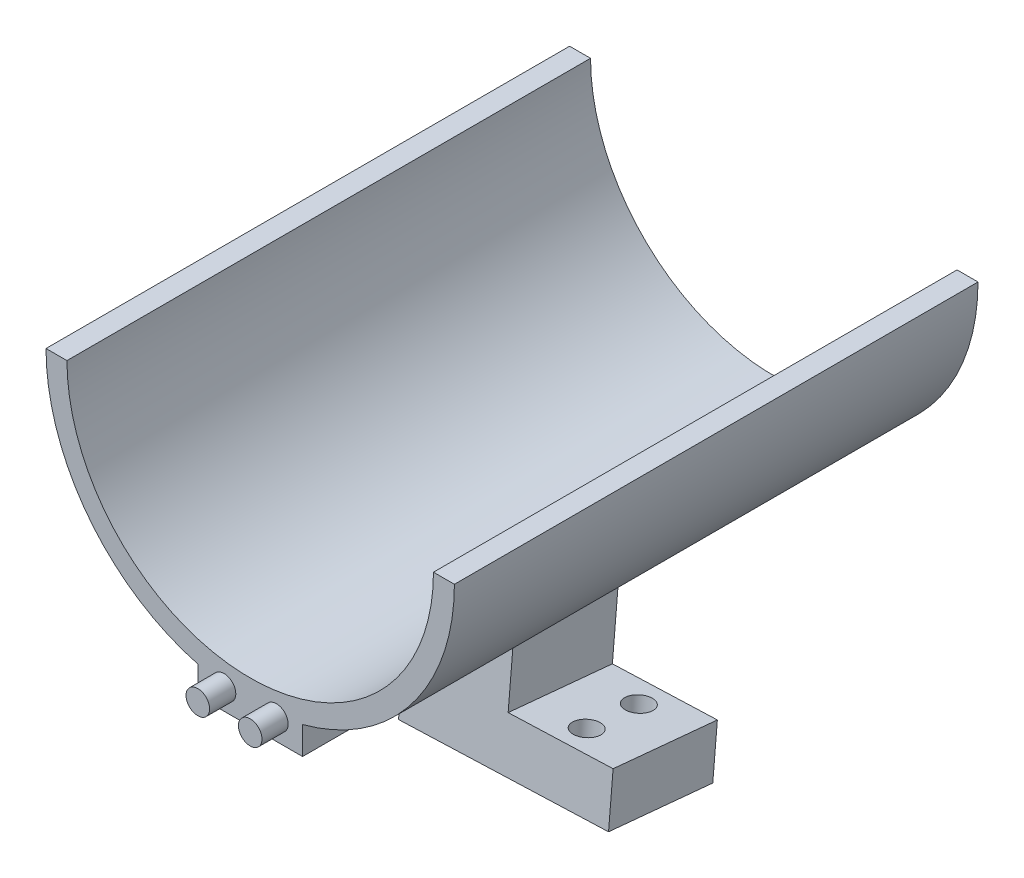
ISO-10303-21;
HEADER;
FILE_DESCRIPTION(('STEP AP214'),'2;1');
FILE_NAME('part.step','',(''),(''),'','','');
FILE_SCHEMA(('AUTOMOTIVE_DESIGN { 1 0 10303 214 1 1 1 1 }'));
ENDSEC;
DATA;
#1=APPLICATION_CONTEXT('core data for automotive mechanical design processes');
#2=APPLICATION_PROTOCOL_DEFINITION('international standard','automotive_design',2000,#1);
#3=PRODUCT_CONTEXT('',#1,'mechanical');
#4=PRODUCT('Part','Part','',(#3));
#5=PRODUCT_RELATED_PRODUCT_CATEGORY('part','',(#4));
#6=PRODUCT_DEFINITION_FORMATION('','',#4);
#7=PRODUCT_DEFINITION_CONTEXT('part definition',#1,'design');
#8=PRODUCT_DEFINITION('design','',#6,#7);
#9=PRODUCT_DEFINITION_SHAPE('','',#8);
#10=(LENGTH_UNIT() NAMED_UNIT(*) SI_UNIT(.MILLI.,.METRE.));
#11=(NAMED_UNIT(*) PLANE_ANGLE_UNIT() SI_UNIT($,.RADIAN.));
#12=(NAMED_UNIT(*) SI_UNIT($,.STERADIAN.) SOLID_ANGLE_UNIT());
#13=UNCERTAINTY_MEASURE_WITH_UNIT(LENGTH_MEASURE(1.E-05),#10,'distance_accuracy_value','');
#14=(GEOMETRIC_REPRESENTATION_CONTEXT(3) GLOBAL_UNCERTAINTY_ASSIGNED_CONTEXT((#13)) GLOBAL_UNIT_ASSIGNED_CONTEXT((#10,
#11,#12)) REPRESENTATION_CONTEXT('',''));
#15=CARTESIAN_POINT('',(0.,0.,0.));
#16=DIRECTION('',(0.,0.,1.));
#17=DIRECTION('',(1.,0.,0.));
#18=AXIS2_PLACEMENT_3D('',#15,#16,#17);
#19=CARTESIAN_POINT('',(9.99999999999999,3.11086419730137,35.544910429642));
#20=DIRECTION('',(-1.,0.,0.));
#21=DIRECTION('',(0.,0.,1.));
#22=AXIS2_PLACEMENT_3D('',#19,#20,#21);
#23=PLANE('',#22);
#24=DIRECTION('',(0.,0.094315540424243,0.995542354113818));
#25=VECTOR('',#24,1.);
#26=CARTESIAN_POINT('',(9.99999999999999,-57.2444439239016,40.825315673861));
#27=LINE('',#26,#25);
#28=CARTESIAN_POINT('',(9.99999999999999,-57.2444439239017,40.825315673861));
#29=VERTEX_POINT('',#28);
#30=CARTESIAN_POINT('',(10.,-55.3580843640994,60.7366773479115));
#31=VERTEX_POINT('',#30);
#32=EDGE_CURVE('E53',#29,#31,#27,.T.);
#33=ORIENTED_EDGE('',*,*,#32,.F.);
#34=DIRECTION('',(0.,-0.996194698091746,0.0871557427476515));
#35=VECTOR('',#34,1.);
#36=CARTESIAN_POINT('',(9.99999999999999,3.11086419730137,35.544910429642));
#37=LINE('',#36,#35);
#38=CARTESIAN_POINT('',(9.99999999999999,-37.6961536499415,39.1150618835755));
#39=VERTEX_POINT('',#38);
#40=EDGE_CURVE('E207',#39,#29,#37,.T.);
#41=ORIENTED_EDGE('',*,*,#40,.F.);
#42=DIRECTION('',(0.,0.,-1.));
#43=VECTOR('',#42,1.);
#44=CARTESIAN_POINT('',(10.,-37.6961536499415,100.));
#45=LINE('',#44,#43);
#46=CARTESIAN_POINT('',(10.,-37.6961536499415,59.1914586344425));
#47=VERTEX_POINT('',#46);
#48=EDGE_CURVE('E209',#47,#39,#45,.T.);
#49=ORIENTED_EDGE('',*,*,#48,.F.);
#50=DIRECTION('',(0.,-0.996194698091746,0.0871557427476515));
#51=VECTOR('',#50,1.);
#52=CARTESIAN_POINT('',(10.,4.8539790522544,55.4688043914769));
#53=LINE('',#52,#51);
#54=EDGE_CURVE('E58',#47,#31,#53,.T.);
#55=ORIENTED_EDGE('',*,*,#54,.T.);
#56=EDGE_LOOP('',(#33,#41,#49,#55));
#57=FACE_BOUND('',#56,.T.);
#58=ADVANCED_FACE('F38',(#57),#23,.F.);
#59=CARTESIAN_POINT('',(0.,0.,100.));
#60=DIRECTION('',(0.,0.,-1.));
#61=DIRECTION('',(-1.,0.,0.));
#62=AXIS2_PLACEMENT_3D('',#59,#60,#61);
#63=CYLINDRICAL_SURFACE('',#62,39.);
#64=DIRECTION('',(0.,0.,-1.));
#65=VECTOR('',#64,1.);
#66=CARTESIAN_POINT('',(10.,-37.6961536499415,100.));
#67=LINE('',#66,#65);
#68=CARTESIAN_POINT('',(10.,-37.6961536499415,0.));
#69=VERTEX_POINT('',#68);
#70=CARTESIAN_POINT('',(10.,-37.6961536499415,9.99999999999999));
#71=VERTEX_POINT('',#70);
#72=EDGE_CURVE('E255',#69,#71,#67,.F.);
#73=ORIENTED_EDGE('',*,*,#72,.F.);
#74=CARTESIAN_POINT('',(0.,0.,0.));
#75=DIRECTION('',(0.,0.,1.));
#76=DIRECTION('',(1.,0.,0.));
#77=AXIS2_PLACEMENT_3D('',#74,#75,#76);
#78=CIRCLE('',#77,39.);
#79=CARTESIAN_POINT('',(39.,0.,0.));
#80=VERTEX_POINT('',#79);
#81=EDGE_CURVE('E300',#69,#80,#78,.T.);
#82=ORIENTED_EDGE('',*,*,#81,.T.);
#83=DIRECTION('',(0.,0.,-1.));
#84=VECTOR('',#83,1.);
#85=CARTESIAN_POINT('',(39.,0.,100.));
#86=LINE('',#85,#84);
#87=CARTESIAN_POINT('',(39.,0.,100.));
#88=VERTEX_POINT('',#87);
#89=EDGE_CURVE('E11',#88,#80,#86,.T.);
#90=ORIENTED_EDGE('',*,*,#89,.F.);
#91=CARTESIAN_POINT('',(0.,0.,100.));
#92=DIRECTION('',(0.,0.,1.));
#93=DIRECTION('',(1.,0.,0.));
#94=AXIS2_PLACEMENT_3D('',#91,#92,#93);
#95=CIRCLE('',#94,39.);
#96=CARTESIAN_POINT('',(10.,-37.6961536499415,100.));
#97=VERTEX_POINT('',#96);
#98=EDGE_CURVE('E305',#97,#88,#95,.T.);
#99=ORIENTED_EDGE('',*,*,#98,.F.);
#100=DIRECTION('',(0.,0.,-1.));
#101=VECTOR('',#100,1.);
#102=CARTESIAN_POINT('',(10.,-37.6961536499415,100.));
#103=LINE('',#102,#101);
#104=CARTESIAN_POINT('',(10.,-37.6961536499415,90.));
#105=VERTEX_POINT('',#104);
#106=EDGE_CURVE('E292',#97,#105,#103,.T.);
#107=ORIENTED_EDGE('',*,*,#106,.T.);
#108=CARTESIAN_POINT('',(0.,0.,90.));
#109=DIRECTION('',(0.,0.,1.));
#110=DIRECTION('',(1.,0.,0.));
#111=AXIS2_PLACEMENT_3D('',#108,#109,#110);
#112=CIRCLE('',#111,39.);
#113=CARTESIAN_POINT('',(-10.,-37.6961536499415,90.));
#114=VERTEX_POINT('',#113);
#115=EDGE_CURVE('E298',#114,#105,#112,.T.);
#116=ORIENTED_EDGE('',*,*,#115,.F.);
#117=DIRECTION('',(0.,0.,-1.));
#118=VECTOR('',#117,1.);
#119=CARTESIAN_POINT('',(-10.,-37.6961536499415,100.));
#120=LINE('',#119,#118);
#121=CARTESIAN_POINT('',(-10.,-37.6961536499415,100.));
#122=VERTEX_POINT('',#121);
#123=EDGE_CURVE('E296',#122,#114,#120,.T.);
#124=ORIENTED_EDGE('',*,*,#123,.F.);
#125=CARTESIAN_POINT('',(-39.,0.,100.));
#126=VERTEX_POINT('',#125);
#127=EDGE_CURVE('E301',#126,#122,#95,.T.);
#128=ORIENTED_EDGE('',*,*,#127,.F.);
#129=DIRECTION('',(0.,0.,-1.));
#130=VECTOR('',#129,1.);
#131=CARTESIAN_POINT('',(-39.,0.,100.));
#132=LINE('',#131,#130);
#133=CARTESIAN_POINT('',(-39.,0.,0.));
#134=VERTEX_POINT('',#133);
#135=EDGE_CURVE('E313',#126,#134,#132,.T.);
#136=ORIENTED_EDGE('',*,*,#135,.T.);
#137=CARTESIAN_POINT('',(-10.,-37.6961536499415,0.));
#138=VERTEX_POINT('',#137);
#139=EDGE_CURVE('E314',#134,#138,#78,.T.);
#140=ORIENTED_EDGE('',*,*,#139,.T.);
#141=DIRECTION('',(0.,0.,-1.));
#142=VECTOR('',#141,1.);
#143=CARTESIAN_POINT('',(-10.,-37.6961536499415,100.));
#144=LINE('',#143,#142);
#145=CARTESIAN_POINT('',(-10.,-37.6961536499415,9.99999999999999));
#146=VERTEX_POINT('',#145);
#147=EDGE_CURVE('E252',#138,#146,#144,.F.);
#148=ORIENTED_EDGE('',*,*,#147,.T.);
#149=CARTESIAN_POINT('',(0.,0.,9.99999999999999));
#150=DIRECTION('',(0.,0.,-1.));
#151=DIRECTION('',(-1.,0.,0.));
#152=AXIS2_PLACEMENT_3D('',#149,#150,#151);
#153=CIRCLE('',#152,39.);
#154=EDGE_CURVE('E258',#71,#146,#153,.T.);
#155=ORIENTED_EDGE('',*,*,#154,.F.);
#156=EDGE_LOOP('',(#73,#82,#90,#99,#107,#116,#124,#128,#136,#140,#148,#155));
#157=FACE_BOUND('',#156,.T.);
#158=ORIENTED_EDGE('',*,*,#48,.T.);
#159=CARTESIAN_POINT('',(0.,0.,35.8170757806745));
#160=DIRECTION('',(0.,0.0871557427476515,0.996194698091746));
#161=DIRECTION('',(0.,0.996194698091746,-0.0871557427476515));
#162=AXIS2_PLACEMENT_3D('',#159,#160,#161);
#163=ELLIPSE('',#162,39.1489736641905,39.);
#164=CARTESIAN_POINT('',(-9.99999999999999,-37.6961536499415,39.1150618835756));
#165=VERTEX_POINT('',#164);
#166=EDGE_CURVE('E206',#39,#165,#163,.F.);
#167=ORIENTED_EDGE('',*,*,#166,.T.);
#168=DIRECTION('',(0.,0.,-1.));
#169=VECTOR('',#168,1.);
#170=CARTESIAN_POINT('',(-9.99999999999999,-37.6961536499415,100.));
#171=LINE('',#170,#169);
#172=CARTESIAN_POINT('',(-10.,-37.6961536499415,59.1914586344425));
#173=VERTEX_POINT('',#172);
#174=EDGE_CURVE('E204',#165,#173,#171,.F.);
#175=ORIENTED_EDGE('',*,*,#174,.T.);
#176=CARTESIAN_POINT('',(0.,0.,55.8934725315415));
#177=DIRECTION('',(0.,-0.0871557427476515,-0.996194698091746));
#178=DIRECTION('',(0.,0.996194698091746,-0.0871557427476515));
#179=AXIS2_PLACEMENT_3D('',#176,#177,#178);
#180=ELLIPSE('',#179,39.1489736641905,39.);
#181=EDGE_CURVE('E211',#173,#47,#180,.F.);
#182=ORIENTED_EDGE('',*,*,#181,.T.);
#183=EDGE_LOOP('',(#158,#167,#175,#182));
#184=FACE_BOUND('',#183,.T.);
#185=ADVANCED_FACE('F40',(#157,#184),#63,.T.);
#186=CARTESIAN_POINT('',(35.,0.,100.));
#187=DIRECTION('',(0.,1.,0.));
#188=DIRECTION('',(0.,0.,1.));
#189=AXIS2_PLACEMENT_3D('',#186,#187,#188);
#190=PLANE('',#189);
#191=DIRECTION('',(1.,0.,0.));
#192=VECTOR('',#191,1.);
#193=CARTESIAN_POINT('',(35.,0.,0.));
#194=LINE('',#193,#192);
#195=CARTESIAN_POINT('',(35.,0.,0.));
#196=VERTEX_POINT('',#195);
#197=EDGE_CURVE('E316',#196,#80,#194,.T.);
#198=ORIENTED_EDGE('',*,*,#197,.F.);
#199=DIRECTION('',(0.,0.,-1.));
#200=VECTOR('',#199,1.);
#201=CARTESIAN_POINT('',(35.,0.,100.));
#202=LINE('',#201,#200);
#203=CARTESIAN_POINT('',(35.,0.,100.));
#204=VERTEX_POINT('',#203);
#205=EDGE_CURVE('E46',#204,#196,#202,.T.);
#206=ORIENTED_EDGE('',*,*,#205,.F.);
#207=DIRECTION('',(1.,0.,0.));
#208=VECTOR('',#207,1.);
#209=CARTESIAN_POINT('',(35.,0.,100.));
#210=LINE('',#209,#208);
#211=EDGE_CURVE('E304',#204,#88,#210,.T.);
#212=ORIENTED_EDGE('',*,*,#211,.T.);
#213=ORIENTED_EDGE('',*,*,#89,.T.);
#214=EDGE_LOOP('',(#198,#206,#212,#213));
#215=FACE_BOUND('',#214,.T.);
#216=ADVANCED_FACE('F335',(#215),#190,.T.);
#217=CARTESIAN_POINT('',(0.,0.,100.));
#218=DIRECTION('',(0.,0.,-1.));
#219=DIRECTION('',(-1.,0.,0.));
#220=AXIS2_PLACEMENT_3D('',#217,#218,#219);
#221=CYLINDRICAL_SURFACE('',#220,35.);
#222=ORIENTED_EDGE('',*,*,#205,.T.);
#223=CARTESIAN_POINT('',(0.,0.,0.));
#224=DIRECTION('',(0.,0.,1.));
#225=DIRECTION('',(1.,0.,0.));
#226=AXIS2_PLACEMENT_3D('',#223,#224,#225);
#227=CIRCLE('',#226,35.);
#228=CARTESIAN_POINT('',(-35.,0.,0.));
#229=VERTEX_POINT('',#228);
#230=EDGE_CURVE('E319',#229,#196,#227,.T.);
#231=ORIENTED_EDGE('',*,*,#230,.F.);
#232=DIRECTION('',(0.,0.,-1.));
#233=VECTOR('',#232,1.);
#234=CARTESIAN_POINT('',(-35.,0.,100.));
#235=LINE('',#234,#233);
#236=CARTESIAN_POINT('',(-35.,0.,100.));
#237=VERTEX_POINT('',#236);
#238=EDGE_CURVE('E325',#237,#229,#235,.T.);
#239=ORIENTED_EDGE('',*,*,#238,.F.);
#240=CARTESIAN_POINT('',(0.,0.,100.));
#241=DIRECTION('',(0.,0.,1.));
#242=DIRECTION('',(1.,0.,0.));
#243=AXIS2_PLACEMENT_3D('',#240,#241,#242);
#244=CIRCLE('',#243,35.);
#245=EDGE_CURVE('E308',#237,#204,#244,.T.);
#246=ORIENTED_EDGE('',*,*,#245,.T.);
#247=EDGE_LOOP('',(#222,#231,#239,#246));
#248=FACE_BOUND('',#247,.T.);
#249=ADVANCED_FACE('F331',(#248),#221,.F.);
#250=CARTESIAN_POINT('',(-39.,0.,100.));
#251=DIRECTION('',(0.,1.,0.));
#252=DIRECTION('',(-1.,0.,0.));
#253=AXIS2_PLACEMENT_3D('',#250,#251,#252);
#254=PLANE('',#253);
#255=DIRECTION('',(1.,0.,0.));
#256=VECTOR('',#255,1.);
#257=CARTESIAN_POINT('',(-39.,0.,0.));
#258=LINE('',#257,#256);
#259=EDGE_CURVE('E321',#134,#229,#258,.T.);
#260=ORIENTED_EDGE('',*,*,#259,.F.);
#261=ORIENTED_EDGE('',*,*,#135,.F.);
#262=DIRECTION('',(1.,0.,0.));
#263=VECTOR('',#262,1.);
#264=CARTESIAN_POINT('',(-39.,0.,100.));
#265=LINE('',#264,#263);
#266=EDGE_CURVE('E310',#126,#237,#265,.T.);
#267=ORIENTED_EDGE('',*,*,#266,.T.);
#268=ORIENTED_EDGE('',*,*,#238,.T.);
#269=EDGE_LOOP('',(#260,#261,#267,#268));
#270=FACE_BOUND('',#269,.T.);
#271=ADVANCED_FACE('F344',(#270),#254,.T.);
#272=CARTESIAN_POINT('',(0.,0.,100.));
#273=DIRECTION('',(0.,0.,1.));
#274=DIRECTION('',(1.,0.,0.));
#275=AXIS2_PLACEMENT_3D('',#272,#273,#274);
#276=PLANE('',#275);
#277=CARTESIAN_POINT('',(5.,-39.,100.));
#278=DIRECTION('',(0.,0.,1.));
#279=DIRECTION('',(1.,0.,0.));
#280=AXIS2_PLACEMENT_3D('',#277,#278,#279);
#281=CIRCLE('',#280,2.25);
#282=CARTESIAN_POINT('',(7.25,-39.,100.));
#283=VERTEX_POINT('',#282);
#284=EDGE_CURVE('E261',#283,#283,#281,.T.);
#285=ORIENTED_EDGE('',*,*,#284,.F.);
#286=EDGE_LOOP('',(#285));
#287=FACE_BOUND('',#286,.T.);
#288=CARTESIAN_POINT('',(-5.,-39.,100.));
#289=DIRECTION('',(0.,0.,1.));
#290=DIRECTION('',(1.,0.,0.));
#291=AXIS2_PLACEMENT_3D('',#288,#289,#290);
#292=CIRCLE('',#291,2.25);
#293=CARTESIAN_POINT('',(-2.75,-39.,100.));
#294=VERTEX_POINT('',#293);
#295=EDGE_CURVE('E265',#294,#294,#292,.T.);
#296=ORIENTED_EDGE('',*,*,#295,.F.);
#297=EDGE_LOOP('',(#296));
#298=FACE_BOUND('',#297,.T.);
#299=ORIENTED_EDGE('',*,*,#127,.T.);
#300=DIRECTION('',(0.,1.,0.));
#301=VECTOR('',#300,1.);
#302=CARTESIAN_POINT('',(-10.,0.,100.));
#303=LINE('',#302,#301);
#304=CARTESIAN_POINT('',(-10.,-43.,100.));
#305=VERTEX_POINT('',#304);
#306=EDGE_CURVE('E278',#305,#122,#303,.T.);
#307=ORIENTED_EDGE('',*,*,#306,.F.);
#308=DIRECTION('',(1.,0.,0.));
#309=VECTOR('',#308,1.);
#310=CARTESIAN_POINT('',(0.,-43.,100.));
#311=LINE('',#310,#309);
#312=CARTESIAN_POINT('',(10.,-43.,100.));
#313=VERTEX_POINT('',#312);
#314=EDGE_CURVE('E271',#305,#313,#311,.T.);
#315=ORIENTED_EDGE('',*,*,#314,.T.);
#316=DIRECTION('',(0.,1.,0.));
#317=VECTOR('',#316,1.);
#318=CARTESIAN_POINT('',(10.,0.,100.));
#319=LINE('',#318,#317);
#320=EDGE_CURVE('E287',#313,#97,#319,.T.);
#321=ORIENTED_EDGE('',*,*,#320,.T.);
#322=ORIENTED_EDGE('',*,*,#98,.T.);
#323=ORIENTED_EDGE('',*,*,#211,.F.);
#324=ORIENTED_EDGE('',*,*,#245,.F.);
#325=ORIENTED_EDGE('',*,*,#266,.F.);
#326=EDGE_LOOP('',(#299,#307,#315,#321,#322,#323,#324,#325));
#327=FACE_BOUND('',#326,.T.);
#328=ADVANCED_FACE('F348',(#287,#298,#327),#276,.T.);
#329=CARTESIAN_POINT('',(0.,0.,0.));
#330=DIRECTION('',(0.,0.,1.));
#331=DIRECTION('',(1.,0.,0.));
#332=AXIS2_PLACEMENT_3D('',#329,#330,#331);
#333=PLANE('',#332);
#334=CARTESIAN_POINT('',(5.,-39.,0.));
#335=DIRECTION('',(0.,0.,-1.));
#336=DIRECTION('',(-1.,0.,0.));
#337=AXIS2_PLACEMENT_3D('',#334,#335,#336);
#338=CIRCLE('',#337,2.25);
#339=CARTESIAN_POINT('',(2.75,-39.,0.));
#340=VERTEX_POINT('',#339);
#341=EDGE_CURVE('E224',#340,#340,#338,.T.);
#342=ORIENTED_EDGE('',*,*,#341,.F.);
#343=EDGE_LOOP('',(#342));
#344=FACE_BOUND('',#343,.T.);
#345=CARTESIAN_POINT('',(-5.,-39.,0.));
#346=DIRECTION('',(0.,0.,-1.));
#347=DIRECTION('',(-1.,0.,0.));
#348=AXIS2_PLACEMENT_3D('',#345,#346,#347);
#349=CIRCLE('',#348,2.25);
#350=CARTESIAN_POINT('',(-7.25,-39.,0.));
#351=VERTEX_POINT('',#350);
#352=EDGE_CURVE('E219',#351,#351,#349,.T.);
#353=ORIENTED_EDGE('',*,*,#352,.F.);
#354=EDGE_LOOP('',(#353));
#355=FACE_BOUND('',#354,.T.);
#356=ORIENTED_EDGE('',*,*,#81,.F.);
#357=DIRECTION('',(0.,1.,0.));
#358=VECTOR('',#357,1.);
#359=CARTESIAN_POINT('',(10.,0.,0.));
#360=LINE('',#359,#358);
#361=CARTESIAN_POINT('',(10.,-43.,0.));
#362=VERTEX_POINT('',#361);
#363=EDGE_CURVE('E236',#362,#69,#360,.T.);
#364=ORIENTED_EDGE('',*,*,#363,.F.);
#365=DIRECTION('',(-1.,0.,0.));
#366=VECTOR('',#365,1.);
#367=CARTESIAN_POINT('',(0.,-43.,0.));
#368=LINE('',#367,#366);
#369=CARTESIAN_POINT('',(-10.,-43.,0.));
#370=VERTEX_POINT('',#369);
#371=EDGE_CURVE('E223',#362,#370,#368,.T.);
#372=ORIENTED_EDGE('',*,*,#371,.T.);
#373=DIRECTION('',(0.,1.,0.));
#374=VECTOR('',#373,1.);
#375=CARTESIAN_POINT('',(-10.,0.,0.));
#376=LINE('',#375,#374);
#377=EDGE_CURVE('E245',#370,#138,#376,.T.);
#378=ORIENTED_EDGE('',*,*,#377,.T.);
#379=ORIENTED_EDGE('',*,*,#139,.F.);
#380=ORIENTED_EDGE('',*,*,#259,.T.);
#381=ORIENTED_EDGE('',*,*,#230,.T.);
#382=ORIENTED_EDGE('',*,*,#197,.T.);
#383=EDGE_LOOP('',(#356,#364,#372,#378,#379,#380,#381,#382));
#384=FACE_BOUND('',#383,.T.);
#385=ADVANCED_FACE('F338',(#344,#355,#384),#333,.F.);
#386=CARTESIAN_POINT('',(-10.,0.,90.));
#387=DIRECTION('',(1.,0.,0.));
#388=DIRECTION('',(0.,0.,-1.));
#389=AXIS2_PLACEMENT_3D('',#386,#387,#388);
#390=PLANE('',#389);
#391=ORIENTED_EDGE('',*,*,#306,.T.);
#392=ORIENTED_EDGE('',*,*,#123,.T.);
#393=DIRECTION('',(0.,1.,0.));
#394=VECTOR('',#393,1.);
#395=CARTESIAN_POINT('',(-10.,0.,90.));
#396=LINE('',#395,#394);
#397=CARTESIAN_POINT('',(-10.,-43.,90.));
#398=VERTEX_POINT('',#397);
#399=EDGE_CURVE('E281',#398,#114,#396,.T.);
#400=ORIENTED_EDGE('',*,*,#399,.F.);
#401=DIRECTION('',(0.,0.,1.));
#402=VECTOR('',#401,1.);
#403=CARTESIAN_POINT('',(-10.,-43.,90.));
#404=LINE('',#403,#402);
#405=EDGE_CURVE('E290',#398,#305,#404,.T.);
#406=ORIENTED_EDGE('',*,*,#405,.T.);
#407=EDGE_LOOP('',(#391,#392,#400,#406));
#408=FACE_BOUND('',#407,.T.);
#409=ADVANCED_FACE('F405',(#408),#390,.F.);
#410=CARTESIAN_POINT('',(10.,0.,90.));
#411=DIRECTION('',(1.,0.,0.));
#412=DIRECTION('',(0.,0.,-1.));
#413=AXIS2_PLACEMENT_3D('',#410,#411,#412);
#414=PLANE('',#413);
#415=ORIENTED_EDGE('',*,*,#106,.F.);
#416=ORIENTED_EDGE('',*,*,#320,.F.);
#417=DIRECTION('',(0.,0.,1.));
#418=VECTOR('',#417,1.);
#419=CARTESIAN_POINT('',(10.,-43.,90.));
#420=LINE('',#419,#418);
#421=CARTESIAN_POINT('',(10.,-43.,90.));
#422=VERTEX_POINT('',#421);
#423=EDGE_CURVE('E284',#422,#313,#420,.T.);
#424=ORIENTED_EDGE('',*,*,#423,.F.);
#425=DIRECTION('',(0.,1.,0.));
#426=VECTOR('',#425,1.);
#427=CARTESIAN_POINT('',(10.,0.,90.));
#428=LINE('',#427,#426);
#429=EDGE_CURVE('E277',#422,#105,#428,.T.);
#430=ORIENTED_EDGE('',*,*,#429,.T.);
#431=EDGE_LOOP('',(#415,#416,#424,#430));
#432=FACE_BOUND('',#431,.T.);
#433=ADVANCED_FACE('F412',(#432),#414,.T.);
#434=CARTESIAN_POINT('',(0.,-43.,90.));
#435=DIRECTION('',(0.,-1.,0.));
#436=DIRECTION('',(0.,0.,-1.));
#437=AXIS2_PLACEMENT_3D('',#434,#435,#436);
#438=PLANE('',#437);
#439=ORIENTED_EDGE('',*,*,#314,.F.);
#440=ORIENTED_EDGE('',*,*,#405,.F.);
#441=DIRECTION('',(1.,0.,0.));
#442=VECTOR('',#441,1.);
#443=CARTESIAN_POINT('',(0.,-43.,90.));
#444=LINE('',#443,#442);
#445=EDGE_CURVE('E274',#398,#422,#444,.T.);
#446=ORIENTED_EDGE('',*,*,#445,.T.);
#447=ORIENTED_EDGE('',*,*,#423,.T.);
#448=EDGE_LOOP('',(#439,#440,#446,#447));
#449=FACE_BOUND('',#448,.T.);
#450=ADVANCED_FACE('F722',(#449),#438,.T.);
#451=CARTESIAN_POINT('',(0.,0.,90.));
#452=DIRECTION('',(0.,0.,1.));
#453=DIRECTION('',(1.,0.,0.));
#454=AXIS2_PLACEMENT_3D('',#451,#452,#453);
#455=PLANE('',#454);
#456=ORIENTED_EDGE('',*,*,#399,.T.);
#457=ORIENTED_EDGE('',*,*,#115,.T.);
#458=ORIENTED_EDGE('',*,*,#429,.F.);
#459=ORIENTED_EDGE('',*,*,#445,.F.);
#460=EDGE_LOOP('',(#456,#457,#458,#459));
#461=FACE_BOUND('',#460,.T.);
#462=ADVANCED_FACE('F451',(#461),#455,.F.);
#463=CARTESIAN_POINT('',(-5.,-39.,105.));
#464=DIRECTION('',(0.,0.,-1.));
#465=DIRECTION('',(-1.,0.,0.));
#466=AXIS2_PLACEMENT_3D('',#463,#464,#465);
#467=CYLINDRICAL_SURFACE('',#466,2.25);
#468=CARTESIAN_POINT('',(-5.,-39.,105.));
#469=DIRECTION('',(0.,0.,1.));
#470=DIRECTION('',(1.,0.,0.));
#471=AXIS2_PLACEMENT_3D('',#468,#469,#470);
#472=CIRCLE('',#471,2.25);
#473=CARTESIAN_POINT('',(-2.75,-39.,105.));
#474=VERTEX_POINT('',#473);
#475=EDGE_CURVE('E268',#474,#474,#472,.T.);
#476=ORIENTED_EDGE('',*,*,#475,.F.);
#477=EDGE_LOOP('',(#476));
#478=FACE_BOUND('',#477,.T.);
#479=ORIENTED_EDGE('',*,*,#295,.T.);
#480=EDGE_LOOP('',(#479));
#481=FACE_BOUND('',#480,.T.);
#482=ADVANCED_FACE('F456',(#478,#481),#467,.T.);
#483=CARTESIAN_POINT('',(0.,0.,105.));
#484=DIRECTION('',(0.,0.,1.));
#485=DIRECTION('',(1.,0.,0.));
#486=AXIS2_PLACEMENT_3D('',#483,#484,#485);
#487=PLANE('',#486);
#488=ORIENTED_EDGE('',*,*,#475,.T.);
#489=EDGE_LOOP('',(#488));
#490=FACE_BOUND('',#489,.T.);
#491=ADVANCED_FACE('F461',(#490),#487,.T.);
#492=CARTESIAN_POINT('',(5.,-39.,105.));
#493=DIRECTION('',(0.,0.,-1.));
#494=DIRECTION('',(-1.,0.,0.));
#495=AXIS2_PLACEMENT_3D('',#492,#493,#494);
#496=CYLINDRICAL_SURFACE('',#495,2.25);
#497=CARTESIAN_POINT('',(5.,-39.,105.));
#498=DIRECTION('',(0.,0.,1.));
#499=DIRECTION('',(1.,0.,0.));
#500=AXIS2_PLACEMENT_3D('',#497,#498,#499);
#501=CIRCLE('',#500,2.25);
#502=CARTESIAN_POINT('',(7.25,-39.,105.));
#503=VERTEX_POINT('',#502);
#504=EDGE_CURVE('E262',#503,#503,#501,.T.);
#505=ORIENTED_EDGE('',*,*,#504,.F.);
#506=EDGE_LOOP('',(#505));
#507=FACE_BOUND('',#506,.T.);
#508=ORIENTED_EDGE('',*,*,#284,.T.);
#509=EDGE_LOOP('',(#508));
#510=FACE_BOUND('',#509,.T.);
#511=ADVANCED_FACE('F472',(#507,#510),#496,.T.);
#512=CARTESIAN_POINT('',(0.,0.,105.));
#513=DIRECTION('',(0.,0.,1.));
#514=DIRECTION('',(1.,0.,0.));
#515=AXIS2_PLACEMENT_3D('',#512,#513,#514);
#516=PLANE('',#515);
#517=ORIENTED_EDGE('',*,*,#504,.T.);
#518=EDGE_LOOP('',(#517));
#519=FACE_BOUND('',#518,.T.);
#520=ADVANCED_FACE('F482',(#519),#516,.T.);
#521=CARTESIAN_POINT('',(10.,0.,10.));
#522=DIRECTION('',(-1.,0.,0.));
#523=DIRECTION('',(0.,0.,1.));
#524=AXIS2_PLACEMENT_3D('',#521,#522,#523);
#525=PLANE('',#524);
#526=ORIENTED_EDGE('',*,*,#363,.T.);
#527=ORIENTED_EDGE('',*,*,#72,.T.);
#528=DIRECTION('',(0.,1.,0.));
#529=VECTOR('',#528,1.);
#530=CARTESIAN_POINT('',(10.,0.,10.));
#531=LINE('',#530,#529);
#532=CARTESIAN_POINT('',(10.,-43.,10.));
#533=VERTEX_POINT('',#532);
#534=EDGE_CURVE('E239',#533,#71,#531,.T.);
#535=ORIENTED_EDGE('',*,*,#534,.F.);
#536=DIRECTION('',(0.,0.,-1.));
#537=VECTOR('',#536,1.);
#538=CARTESIAN_POINT('',(10.,-43.,10.));
#539=LINE('',#538,#537);
#540=EDGE_CURVE('E250',#533,#362,#539,.T.);
#541=ORIENTED_EDGE('',*,*,#540,.T.);
#542=EDGE_LOOP('',(#526,#527,#535,#541));
#543=FACE_BOUND('',#542,.T.);
#544=ADVANCED_FACE('F356',(#543),#525,.F.);
#545=CARTESIAN_POINT('',(-10.,0.,10.));
#546=DIRECTION('',(-1.,0.,0.));
#547=DIRECTION('',(0.,0.,1.));
#548=AXIS2_PLACEMENT_3D('',#545,#546,#547);
#549=PLANE('',#548);
#550=ORIENTED_EDGE('',*,*,#147,.F.);
#551=ORIENTED_EDGE('',*,*,#377,.F.);
#552=DIRECTION('',(0.,0.,-1.));
#553=VECTOR('',#552,1.);
#554=CARTESIAN_POINT('',(-10.,-43.,10.));
#555=LINE('',#554,#553);
#556=CARTESIAN_POINT('',(-10.,-43.,10.));
#557=VERTEX_POINT('',#556);
#558=EDGE_CURVE('E242',#557,#370,#555,.T.);
#559=ORIENTED_EDGE('',*,*,#558,.F.);
#560=DIRECTION('',(0.,1.,0.));
#561=VECTOR('',#560,1.);
#562=CARTESIAN_POINT('',(-10.,0.,10.));
#563=LINE('',#562,#561);
#564=EDGE_CURVE('E235',#557,#146,#563,.T.);
#565=ORIENTED_EDGE('',*,*,#564,.T.);
#566=EDGE_LOOP('',(#550,#551,#559,#565));
#567=FACE_BOUND('',#566,.T.);
#568=ADVANCED_FACE('F365',(#567),#549,.T.);
#569=CARTESIAN_POINT('',(0.,-43.,10.));
#570=DIRECTION('',(0.,-1.,0.));
#571=DIRECTION('',(0.,0.,-1.));
#572=AXIS2_PLACEMENT_3D('',#569,#570,#571);
#573=PLANE('',#572);
#574=ORIENTED_EDGE('',*,*,#371,.F.);
#575=ORIENTED_EDGE('',*,*,#540,.F.);
#576=DIRECTION('',(-1.,0.,0.));
#577=VECTOR('',#576,1.);
#578=CARTESIAN_POINT('',(0.,-43.,10.));
#579=LINE('',#578,#577);
#580=EDGE_CURVE('E232',#533,#557,#579,.T.);
#581=ORIENTED_EDGE('',*,*,#580,.T.);
#582=ORIENTED_EDGE('',*,*,#558,.T.);
#583=EDGE_LOOP('',(#574,#575,#581,#582));
#584=FACE_BOUND('',#583,.T.);
#585=ADVANCED_FACE('F359',(#584),#573,.T.);
#586=CARTESIAN_POINT('',(0.,0.,10.));
#587=DIRECTION('',(0.,0.,-1.));
#588=DIRECTION('',(-1.,0.,0.));
#589=AXIS2_PLACEMENT_3D('',#586,#587,#588);
#590=PLANE('',#589);
#591=ORIENTED_EDGE('',*,*,#534,.T.);
#592=ORIENTED_EDGE('',*,*,#154,.T.);
#593=ORIENTED_EDGE('',*,*,#564,.F.);
#594=ORIENTED_EDGE('',*,*,#580,.F.);
#595=EDGE_LOOP('',(#591,#592,#593,#594));
#596=FACE_BOUND('',#595,.T.);
#597=ADVANCED_FACE('F367',(#596),#590,.F.);
#598=CARTESIAN_POINT('',(-5.,-39.,6.));
#599=DIRECTION('',(0.,0.,-1.));
#600=DIRECTION('',(-1.,0.,0.));
#601=AXIS2_PLACEMENT_3D('',#598,#599,#600);
#602=CYLINDRICAL_SURFACE('',#601,2.25);
#603=CARTESIAN_POINT('',(-5.,-39.,6.));
#604=DIRECTION('',(0.,0.,-1.));
#605=DIRECTION('',(-1.,0.,0.));
#606=AXIS2_PLACEMENT_3D('',#603,#604,#605);
#607=CIRCLE('',#606,2.25);
#608=CARTESIAN_POINT('',(-7.25,-39.,6.));
#609=VERTEX_POINT('',#608);
#610=EDGE_CURVE('E227',#609,#609,#607,.T.);
#611=ORIENTED_EDGE('',*,*,#610,.F.);
#612=EDGE_LOOP('',(#611));
#613=FACE_BOUND('',#612,.T.);
#614=ORIENTED_EDGE('',*,*,#352,.T.);
#615=EDGE_LOOP('',(#614));
#616=FACE_BOUND('',#615,.T.);
#617=ADVANCED_FACE('F369',(#613,#616),#602,.F.);
#618=CARTESIAN_POINT('',(0.,0.,6.));
#619=DIRECTION('',(0.,0.,-1.));
#620=DIRECTION('',(-1.,0.,0.));
#621=AXIS2_PLACEMENT_3D('',#618,#619,#620);
#622=PLANE('',#621);
#623=ORIENTED_EDGE('',*,*,#610,.T.);
#624=EDGE_LOOP('',(#623));
#625=FACE_BOUND('',#624,.T.);
#626=ADVANCED_FACE('F375',(#625),#622,.T.);
#627=CARTESIAN_POINT('',(5.,-39.,6.));
#628=DIRECTION('',(0.,0.,-1.));
#629=DIRECTION('',(-1.,0.,0.));
#630=AXIS2_PLACEMENT_3D('',#627,#628,#629);
#631=CYLINDRICAL_SURFACE('',#630,2.25);
#632=CARTESIAN_POINT('',(5.,-39.,6.));
#633=DIRECTION('',(0.,0.,-1.));
#634=DIRECTION('',(-1.,0.,0.));
#635=AXIS2_PLACEMENT_3D('',#632,#633,#634);
#636=CIRCLE('',#635,2.25);
#637=CARTESIAN_POINT('',(2.75,-39.,6.));
#638=VERTEX_POINT('',#637);
#639=EDGE_CURVE('E220',#638,#638,#636,.T.);
#640=ORIENTED_EDGE('',*,*,#639,.F.);
#641=EDGE_LOOP('',(#640));
#642=FACE_BOUND('',#641,.T.);
#643=ORIENTED_EDGE('',*,*,#341,.T.);
#644=EDGE_LOOP('',(#643));
#645=FACE_BOUND('',#644,.T.);
#646=ADVANCED_FACE('F391',(#642,#645),#631,.F.);
#647=CARTESIAN_POINT('',(0.,0.,6.));
#648=DIRECTION('',(0.,0.,-1.));
#649=DIRECTION('',(-1.,0.,0.));
#650=AXIS2_PLACEMENT_3D('',#647,#648,#649);
#651=PLANE('',#650);
#652=ORIENTED_EDGE('',*,*,#639,.T.);
#653=EDGE_LOOP('',(#652));
#654=FACE_BOUND('',#653,.T.);
#655=ADVANCED_FACE('F388',(#654),#651,.T.);
#656=CARTESIAN_POINT('',(-10.,3.11086419730137,35.544910429642));
#657=DIRECTION('',(0.,0.0871557427476515,0.996194698091746));
#658=DIRECTION('',(0.,-0.996194698091746,0.0871557427476515));
#659=AXIS2_PLACEMENT_3D('',#656,#657,#658);
#660=PLANE('',#659);
#661=ORIENTED_EDGE('',*,*,#166,.F.);
#662=ORIENTED_EDGE('',*,*,#40,.T.);
#663=DIRECTION('',(-0.999411883181242,-0.0341607313667764,0.00298867673238224));
#664=VECTOR('',#663,1.);
#665=CARTESIAN_POINT('',(29.9882376636248,-56.5612292965661,40.7655421392134));
#666=LINE('',#665,#664);
#667=CARTESIAN_POINT('',(29.9882376636248,-56.5612292965661,40.7655421392134));
#668=VERTEX_POINT('',#667);
#669=EDGE_CURVE('E174',#668,#29,#666,.T.);
#670=ORIENTED_EDGE('',*,*,#669,.F.);
#671=DIRECTION('',(0.,0.996194698091746,-0.0871557427476506));
#672=VECTOR('',#671,1.);
#673=CARTESIAN_POINT('',(29.9882376636248,-66.5612292965661,41.6404287744725));
#674=LINE('',#673,#672);
#675=CARTESIAN_POINT('',(29.9882376636248,-66.5612292965661,41.6404287744725));
#676=VERTEX_POINT('',#675);
#677=EDGE_CURVE('E177',#676,#668,#674,.T.);
#678=ORIENTED_EDGE('',*,*,#677,.F.);
#679=DIRECTION('',(-0.999411883181242,-0.0341607313667797,0.00298867673234744));
#680=VECTOR('',#679,1.);
#681=CARTESIAN_POINT('',(-10.9554066463384,-67.9607171933854,41.7628681001867));
#682=LINE('',#681,#680);
#683=CARTESIAN_POINT('',(-10.,-67.9280605977007,41.7600110182749));
#684=VERTEX_POINT('',#683);
#685=EDGE_CURVE('E164',#676,#684,#682,.T.);
#686=ORIENTED_EDGE('',*,*,#685,.T.);
#687=DIRECTION('',(0.,-0.996194698091746,0.0871557427476515));
#688=VECTOR('',#687,1.);
#689=CARTESIAN_POINT('',(-10.,3.11086419730137,35.544910429642));
#690=LINE('',#689,#688);
#691=EDGE_CURVE('E215',#165,#684,#690,.T.);
#692=ORIENTED_EDGE('',*,*,#691,.F.);
#693=EDGE_LOOP('',(#661,#662,#670,#678,#686,#692));
#694=FACE_BOUND('',#693,.T.);
#695=ADVANCED_FACE('F179',(#694),#660,.F.);
#696=CARTESIAN_POINT('',(-10.,3.11086419730137,35.544910429642));
#697=DIRECTION('',(1.,0.,0.));
#698=DIRECTION('',(0.,0.,-1.));
#699=AXIS2_PLACEMENT_3D('',#696,#697,#698);
#700=PLANE('',#699);
#701=ORIENTED_EDGE('',*,*,#174,.F.);
#702=ORIENTED_EDGE('',*,*,#691,.T.);
#703=DIRECTION('',(0.,0.0943155404242425,0.995542354113818));
#704=VECTOR('',#703,1.);
#705=CARTESIAN_POINT('',(-10.,-67.9469638792874,41.5604784983247));
#706=LINE('',#705,#704);
#707=CARTESIAN_POINT('',(-10.,-66.0417010378984,61.6713726923254));
#708=VERTEX_POINT('',#707);
#709=EDGE_CURVE('E171',#684,#708,#706,.T.);
#710=ORIENTED_EDGE('',*,*,#709,.T.);
#711=DIRECTION('',(0.,-0.996194698091746,0.0871557427476515));
#712=VECTOR('',#711,1.);
#713=CARTESIAN_POINT('',(-10.,4.8539790522544,55.4688043914769));
#714=LINE('',#713,#712);
#715=EDGE_CURVE('E213',#173,#708,#714,.T.);
#716=ORIENTED_EDGE('',*,*,#715,.F.);
#717=EDGE_LOOP('',(#701,#702,#710,#716));
#718=FACE_BOUND('',#717,.T.);
#719=ADVANCED_FACE('F560',(#718),#700,.F.);
#720=CARTESIAN_POINT('',(-10.,4.8539790522544,55.4688043914769));
#721=DIRECTION('',(0.,-0.0871557427476515,-0.996194698091746));
#722=DIRECTION('',(0.,0.996194698091746,-0.0871557427476515));
#723=AXIS2_PLACEMENT_3D('',#720,#721,#722);
#724=PLANE('',#723);
#725=ORIENTED_EDGE('',*,*,#181,.F.);
#726=ORIENTED_EDGE('',*,*,#715,.T.);
#727=DIRECTION('',(0.999411883181242,0.0341607313667797,-0.00298867673234744));
#728=VECTOR('',#727,1.);
#729=CARTESIAN_POINT('',(-10.9603345452917,-66.0745260732778,61.6742445108009));
#730=LINE('',#729,#728);
#731=CARTESIAN_POINT('',(29.9882376636248,-64.6748697367639,61.551790448523));
#732=VERTEX_POINT('',#731);
#733=EDGE_CURVE('E202',#708,#732,#730,.T.);
#734=ORIENTED_EDGE('',*,*,#733,.T.);
#735=DIRECTION('',(0.,-0.996194698091746,0.0871557427476512));
#736=VECTOR('',#735,1.);
#737=CARTESIAN_POINT('',(29.9882376636248,-54.6748697367639,60.6769038132639));
#738=LINE('',#737,#736);
#739=CARTESIAN_POINT('',(29.9882376636248,-54.6748697367639,60.6769038132639));
#740=VERTEX_POINT('',#739);
#741=EDGE_CURVE('E188',#740,#732,#738,.T.);
#742=ORIENTED_EDGE('',*,*,#741,.F.);
#743=DIRECTION('',(-0.999411883181242,-0.0341607313667764,0.00298867673238224));
#744=VECTOR('',#743,1.);
#745=CARTESIAN_POINT('',(29.9882376636248,-54.6748697367639,60.6769038132639));
#746=LINE('',#745,#744);
#747=EDGE_CURVE('E196',#740,#31,#746,.T.);
#748=ORIENTED_EDGE('',*,*,#747,.T.);
#749=ORIENTED_EDGE('',*,*,#54,.F.);
#750=EDGE_LOOP('',(#725,#726,#734,#742,#748,#749));
#751=FACE_BOUND('',#750,.T.);
#752=ADVANCED_FACE('F564',(#751),#724,.F.);
#753=CARTESIAN_POINT('',(-146.671753402824,-74.7909466367201,19.0382426357769));
#754=DIRECTION('',(0.0342903346263611,-0.994956889147722,0.0942600747331559));
#755=DIRECTION('',(-0.0336572461819073,-0.0954116912366169,-0.994868734534772));
#756=AXIS2_PLACEMENT_3D('',#753,#754,#755);
#757=PLANE('',#756);
#758=CARTESIAN_POINT('',(20.3381203916718,-66.4127020067951,46.7187612707938));
#759=DIRECTION('',(0.0342903346263611,-0.994956889147722,0.0942600747331559));
#760=DIRECTION('',(0.,-0.0943155404242425,-0.995542354113818));
#761=AXIS2_PLACEMENT_3D('',#758,#759,#760);
#762=CIRCLE('',#761,2.5);
#763=CARTESIAN_POINT('',(20.3381203916718,-66.6484908578557,44.2299053855092));
#764=VERTEX_POINT('',#763);
#765=EDGE_CURVE('E190',#764,#764,#762,.T.);
#766=ORIENTED_EDGE('',*,*,#765,.F.);
#767=EDGE_LOOP('',(#766));
#768=FACE_BOUND('',#767,.T.);
#769=CARTESIAN_POINT('',(20.3381203916718,-65.4694978798972,56.6746991011667));
#770=DIRECTION('',(0.0342903346263611,-0.994956889147722,0.0942600747331559));
#771=DIRECTION('',(0.,-0.0943155404242425,-0.995542354113818));
#772=AXIS2_PLACEMENT_3D('',#769,#770,#771);
#773=CIRCLE('',#772,2.5);
#774=CARTESIAN_POINT('',(20.3381203916718,-65.7052867309578,54.1858432158822));
#775=VERTEX_POINT('',#774);
#776=EDGE_CURVE('E654',#775,#775,#773,.T.);
#777=ORIENTED_EDGE('',*,*,#776,.F.);
#778=EDGE_LOOP('',(#777));
#779=FACE_BOUND('',#778,.T.);
#780=ORIENTED_EDGE('',*,*,#733,.F.);
#781=ORIENTED_EDGE('',*,*,#709,.F.);
#782=ORIENTED_EDGE('',*,*,#685,.F.);
#783=DIRECTION('',(0.,-0.0943155404242426,-0.995542354113818));
#784=VECTOR('',#783,1.);
#785=CARTESIAN_POINT('',(29.9882376636248,-64.6748697367639,61.551790448523));
#786=LINE('',#785,#784);
#787=EDGE_CURVE('E169',#732,#676,#786,.T.);
#788=ORIENTED_EDGE('',*,*,#787,.F.);
#789=EDGE_LOOP('',(#780,#781,#782,#788));
#790=FACE_BOUND('',#789,.T.);
#791=ADVANCED_FACE('F167',(#768,#779,#790),#757,.T.);
#792=CARTESIAN_POINT('',(29.9882376636248,-56.5612292965661,40.7655421392134));
#793=DIRECTION('',(0.0342903346263611,-0.994956889147722,0.0942600747331564));
#794=DIRECTION('',(0.,-0.0943155404242429,-0.995542354113818));
#795=AXIS2_PLACEMENT_3D('',#792,#793,#794);
#796=PLANE('',#795);
#797=CARTESIAN_POINT('',(19.9941185280971,-56.431258904163,45.7731408292842));
#798=DIRECTION('',(-0.0342903346263611,0.994956889147722,-0.0942600747331564));
#799=DIRECTION('',(0.,0.0943155404242429,0.995542354113818));
#800=AXIS2_PLACEMENT_3D('',#797,#798,#799);
#801=CIRCLE('',#800,2.5);
#802=CARTESIAN_POINT('',(19.9941185280971,-56.1954700531024,48.2619967145688));
#803=VERTEX_POINT('',#802);
#804=EDGE_CURVE('E653',#803,#803,#801,.T.);
#805=ORIENTED_EDGE('',*,*,#804,.F.);
#806=EDGE_LOOP('',(#805));
#807=FACE_BOUND('',#806,.T.);
#808=CARTESIAN_POINT('',(19.9941185280971,-55.4880547772651,55.7290786596571));
#809=DIRECTION('',(-0.0342903346263611,0.994956889147722,-0.0942600747331564));
#810=DIRECTION('',(0.,0.0943155404242429,0.995542354113818));
#811=AXIS2_PLACEMENT_3D('',#808,#809,#810);
#812=CIRCLE('',#811,2.5);
#813=CARTESIAN_POINT('',(19.9941185280971,-55.2522659262045,58.2179345449417));
#814=VERTEX_POINT('',#813);
#815=EDGE_CURVE('E655',#814,#814,#812,.T.);
#816=ORIENTED_EDGE('',*,*,#815,.F.);
#817=EDGE_LOOP('',(#816));
#818=FACE_BOUND('',#817,.T.);
#819=ORIENTED_EDGE('',*,*,#32,.T.);
#820=ORIENTED_EDGE('',*,*,#747,.F.);
#821=DIRECTION('',(0.,0.094315540424243,0.995542354113818));
#822=VECTOR('',#821,1.);
#823=CARTESIAN_POINT('',(29.9882376636248,-56.5612292965661,40.7655421392134));
#824=LINE('',#823,#822);
#825=EDGE_CURVE('E183',#668,#740,#824,.T.);
#826=ORIENTED_EDGE('',*,*,#825,.F.);
#827=ORIENTED_EDGE('',*,*,#669,.T.);
#828=EDGE_LOOP('',(#819,#820,#826,#827));
#829=FACE_BOUND('',#828,.T.);
#830=ADVANCED_FACE('F601',(#807,#818,#829),#796,.F.);
#831=CARTESIAN_POINT('',(29.9882376636248,0.683214627335529,-0.0597735346476464));
#832=DIRECTION('',(1.,0.,0.));
#833=DIRECTION('',(0.,0.,-1.));
#834=AXIS2_PLACEMENT_3D('',#831,#832,#833);
#835=PLANE('',#834);
#836=ORIENTED_EDGE('',*,*,#787,.T.);
#837=ORIENTED_EDGE('',*,*,#677,.T.);
#838=ORIENTED_EDGE('',*,*,#825,.T.);
#839=ORIENTED_EDGE('',*,*,#741,.T.);
#840=EDGE_LOOP('',(#836,#837,#838,#839));
#841=FACE_BOUND('',#840,.T.);
#842=ADVANCED_FACE('F186',(#841),#835,.T.);
#843=CARTESIAN_POINT('',(20.6799252206243,-75.3871925602195,57.6142801543203));
#844=DIRECTION('',(-0.0342903346263611,0.994956889147722,-0.0942600747331564));
#845=DIRECTION('',(0.,0.0943155404242429,0.995542354113818));
#846=AXIS2_PLACEMENT_3D('',#843,#844,#845);
#847=CYLINDRICAL_SURFACE('',#846,2.5);
#848=ORIENTED_EDGE('',*,*,#776,.T.);
#849=EDGE_LOOP('',(#848));
#850=FACE_BOUND('',#849,.T.);
#851=ORIENTED_EDGE('',*,*,#815,.T.);
#852=EDGE_LOOP('',(#851));
#853=FACE_BOUND('',#852,.T.);
#854=ADVANCED_FACE('F600',(#850,#853),#847,.F.);
#855=CARTESIAN_POINT('',(20.6799252206243,-76.3303966871174,47.6583423239473));
#856=DIRECTION('',(-0.0342903346263611,0.994956889147722,-0.0942600747331564));
#857=DIRECTION('',(0.,0.0943155404242429,0.995542354113818));
#858=AXIS2_PLACEMENT_3D('',#855,#856,#857);
#859=CYLINDRICAL_SURFACE('',#858,2.5);
#860=ORIENTED_EDGE('',*,*,#765,.T.);
#861=EDGE_LOOP('',(#860));
#862=FACE_BOUND('',#861,.T.);
#863=ORIENTED_EDGE('',*,*,#804,.T.);
#864=EDGE_LOOP('',(#863));
#865=FACE_BOUND('',#864,.T.);
#866=ADVANCED_FACE('F628',(#862,#865),#859,.F.);
#867=CLOSED_SHELL('',(#58,#185,#216,#249,#271,#328,#385,#409,#433,#450,#462,#482,#491,#511,#520,
#544,#568,#585,#597,#617,#626,#646,#655,#695,#719,#752,#791,#830,#842,#854,#866));
#868=MANIFOLD_SOLID_BREP('B2',#867);
#869=ADVANCED_BREP_SHAPE_REPRESENTATION('',(#18,#868),#14);
#870=SHAPE_DEFINITION_REPRESENTATION(#9,#869);
ENDSEC;
END-ISO-10303-21;
